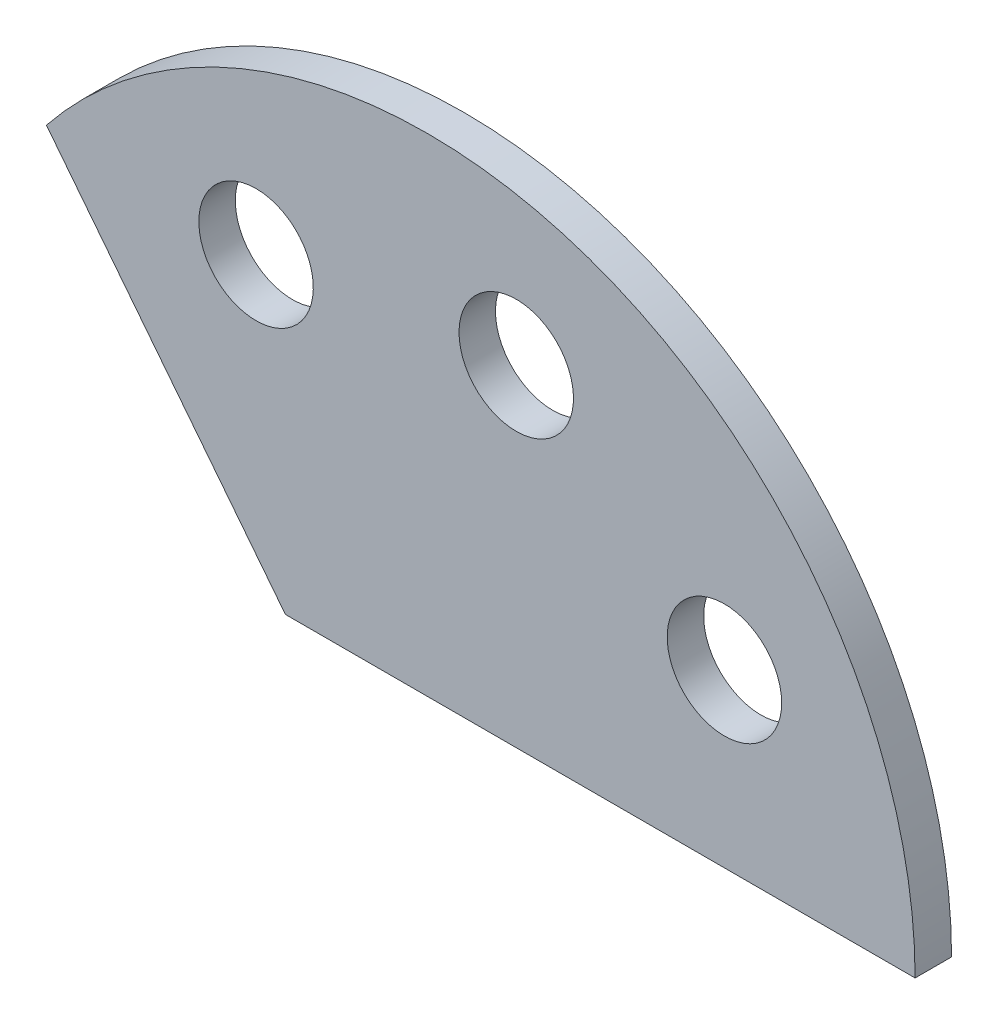
ISO-10303-21;
HEADER;
FILE_DESCRIPTION(('STEP AP214'),'2;1');
FILE_NAME('part.step','',(''),(''),'','','');
FILE_SCHEMA(('AUTOMOTIVE_DESIGN { 1 0 10303 214 1 1 1 1 }'));
ENDSEC;
DATA;
#1=APPLICATION_CONTEXT('core data for automotive mechanical design processes');
#2=APPLICATION_PROTOCOL_DEFINITION('international standard','automotive_design',2000,#1);
#3=PRODUCT_CONTEXT('',#1,'mechanical');
#4=PRODUCT('Part','Part','',(#3));
#5=PRODUCT_RELATED_PRODUCT_CATEGORY('part','',(#4));
#6=PRODUCT_DEFINITION_FORMATION('','',#4);
#7=PRODUCT_DEFINITION_CONTEXT('part definition',#1,'design');
#8=PRODUCT_DEFINITION('design','',#6,#7);
#9=PRODUCT_DEFINITION_SHAPE('','',#8);
#10=(LENGTH_UNIT() NAMED_UNIT(*) SI_UNIT(.MILLI.,.METRE.));
#11=(NAMED_UNIT(*) PLANE_ANGLE_UNIT() SI_UNIT($,.RADIAN.));
#12=(NAMED_UNIT(*) SI_UNIT($,.STERADIAN.) SOLID_ANGLE_UNIT());
#13=UNCERTAINTY_MEASURE_WITH_UNIT(LENGTH_MEASURE(1.E-05),#10,'distance_accuracy_value','');
#14=(GEOMETRIC_REPRESENTATION_CONTEXT(3) GLOBAL_UNCERTAINTY_ASSIGNED_CONTEXT((#13)) GLOBAL_UNIT_ASSIGNED_CONTEXT((#10,
#11,#12)) REPRESENTATION_CONTEXT('',''));
#15=CARTESIAN_POINT('',(0.,0.,0.));
#16=DIRECTION('',(0.,0.,1.));
#17=DIRECTION('',(1.,0.,0.));
#18=AXIS2_PLACEMENT_3D('',#15,#16,#17);
#19=CARTESIAN_POINT('',(-21.5053407886397,37.2483428800069,-4.572));
#20=DIRECTION('',(0.,0.,1.));
#21=DIRECTION('',(0.,1.,0.));
#22=AXIS2_PLACEMENT_3D('',#19,#20,#21);
#23=CYLINDRICAL_SURFACE('',#22,7.17801637442588);
#24=CARTESIAN_POINT('',(-21.5053407886397,37.2483428800069,-4.572));
#25=DIRECTION('',(0.,0.,1.));
#26=DIRECTION('',(0.,1.,0.));
#27=AXIS2_PLACEMENT_3D('',#24,#25,#26);
#28=CIRCLE('',#27,7.17801637442588);
#29=CARTESIAN_POINT('',(-21.5053407886398,44.4263592544328,-4.572));
#30=VERTEX_POINT('',#29);
#31=EDGE_CURVE('E39',#30,#30,#28,.T.);
#32=ORIENTED_EDGE('',*,*,#31,.F.);
#33=EDGE_LOOP('',(#32));
#34=FACE_BOUND('',#33,.T.);
#35=CARTESIAN_POINT('',(-21.5053407886397,37.2483428800069,0.));
#36=DIRECTION('',(0.,0.,1.));
#37=DIRECTION('',(0.,1.,0.));
#38=AXIS2_PLACEMENT_3D('',#35,#36,#37);
#39=CIRCLE('',#38,7.17801637442588);
#40=CARTESIAN_POINT('',(-21.5053407886398,44.4263592544328,0.));
#41=VERTEX_POINT('',#40);
#42=EDGE_CURVE('E11',#41,#41,#39,.T.);
#43=ORIENTED_EDGE('',*,*,#42,.T.);
#44=EDGE_LOOP('',(#43));
#45=FACE_BOUND('',#44,.T.);
#46=ADVANCED_FACE('F31',(#34,#45),#23,.F.);
#47=CARTESIAN_POINT('',(11.1319835350398,41.5451281417894,-4.572));
#48=DIRECTION('',(0.,0.,1.));
#49=DIRECTION('',(0.707106781186546,0.707106781186549,0.));
#50=AXIS2_PLACEMENT_3D('',#47,#48,#49);
#51=CYLINDRICAL_SURFACE('',#50,7.17801637442588);
#52=CARTESIAN_POINT('',(11.1319835350398,41.5451281417894,-4.572));
#53=DIRECTION('',(0.,0.,1.));
#54=DIRECTION('',(0.707106781186546,0.707106781186549,0.));
#55=AXIS2_PLACEMENT_3D('',#52,#53,#54);
#56=CIRCLE('',#55,7.17801637442588);
#57=CARTESIAN_POINT('',(16.2076075888644,46.620752195614,-4.572));
#58=VERTEX_POINT('',#57);
#59=EDGE_CURVE('E95',#58,#58,#56,.T.);
#60=ORIENTED_EDGE('',*,*,#59,.F.);
#61=EDGE_LOOP('',(#60));
#62=FACE_BOUND('',#61,.T.);
#63=CARTESIAN_POINT('',(11.1319835350398,41.5451281417894,0.));
#64=DIRECTION('',(0.,0.,1.));
#65=DIRECTION('',(0.707106781186546,0.707106781186549,0.));
#66=AXIS2_PLACEMENT_3D('',#63,#64,#65);
#67=CIRCLE('',#66,7.17801637442588);
#68=CARTESIAN_POINT('',(16.2076075888644,46.620752195614,0.));
#69=VERTEX_POINT('',#68);
#70=EDGE_CURVE('E99',#69,#69,#67,.T.);
#71=ORIENTED_EDGE('',*,*,#70,.T.);
#72=EDGE_LOOP('',(#71));
#73=FACE_BOUND('',#72,.T.);
#74=ADVANCED_FACE('F108',(#62,#73),#51,.F.);
#75=CARTESIAN_POINT('',(0.,0.,-4.572));
#76=DIRECTION('',(0.,0.,1.));
#77=DIRECTION('',(1.,0.,0.));
#78=AXIS2_PLACEMENT_3D('',#75,#76,#77);
#79=CYLINDRICAL_SURFACE('',#78,61.168535358706);
#80=CARTESIAN_POINT('',(0.,0.,0.));
#81=DIRECTION('',(0.,0.,1.));
#82=DIRECTION('',(1.,0.,0.));
#83=AXIS2_PLACEMENT_3D('',#80,#81,#82);
#84=CIRCLE('',#83,61.168535358706);
#85=CARTESIAN_POINT('',(61.168535358706,0.,0.));
#86=VERTEX_POINT('',#85);
#87=CARTESIAN_POINT('',(-47.8025145738901,38.1642413568289,0.));
#88=VERTEX_POINT('',#87);
#89=EDGE_CURVE('E90',#86,#88,#84,.T.);
#90=ORIENTED_EDGE('',*,*,#89,.F.);
#91=DIRECTION('',(0.,0.,1.));
#92=VECTOR('',#91,1.);
#93=CARTESIAN_POINT('',(61.168535358706,0.,-4.572));
#94=LINE('',#93,#92);
#95=CARTESIAN_POINT('',(61.168535358706,0.,-4.572));
#96=VERTEX_POINT('',#95);
#97=EDGE_CURVE('E47',#96,#86,#94,.T.);
#98=ORIENTED_EDGE('',*,*,#97,.F.);
#99=CARTESIAN_POINT('',(0.,0.,-4.572));
#100=DIRECTION('',(0.,0.,1.));
#101=DIRECTION('',(1.,0.,0.));
#102=AXIS2_PLACEMENT_3D('',#99,#100,#101);
#103=CIRCLE('',#102,61.168535358706);
#104=CARTESIAN_POINT('',(-47.8025145738901,38.1642413568289,-4.572));
#105=VERTEX_POINT('',#104);
#106=EDGE_CURVE('E78',#96,#105,#103,.T.);
#107=ORIENTED_EDGE('',*,*,#106,.T.);
#108=DIRECTION('',(0.,0.,1.));
#109=VECTOR('',#108,1.);
#110=CARTESIAN_POINT('',(-47.8025145738901,38.1642413568289,-4.572));
#111=LINE('',#110,#109);
#112=EDGE_CURVE('E67',#105,#88,#111,.T.);
#113=ORIENTED_EDGE('',*,*,#112,.T.);
#114=EDGE_LOOP('',(#90,#98,#107,#113));
#115=FACE_BOUND('',#114,.T.);
#116=ADVANCED_FACE('F80',(#115),#79,.T.);
#117=CARTESIAN_POINT('',(-17.8260516103918,0.,-4.572));
#118=DIRECTION('',(0.,-1.,0.));
#119=DIRECTION('',(1.,0.,0.));
#120=AXIS2_PLACEMENT_3D('',#117,#118,#119);
#121=PLANE('',#120);
#122=DIRECTION('',(1.,0.,0.));
#123=VECTOR('',#122,1.);
#124=CARTESIAN_POINT('',(-17.8260516103918,0.,0.));
#125=LINE('',#124,#123);
#126=CARTESIAN_POINT('',(-17.8260516103918,0.,0.));
#127=VERTEX_POINT('',#126);
#128=EDGE_CURVE('E81',#127,#86,#125,.T.);
#129=ORIENTED_EDGE('',*,*,#128,.F.);
#130=DIRECTION('',(0.,0.,1.));
#131=VECTOR('',#130,1.);
#132=CARTESIAN_POINT('',(-17.8260516103918,0.,-4.572));
#133=LINE('',#132,#131);
#134=CARTESIAN_POINT('',(-17.8260516103918,0.,-4.572));
#135=VERTEX_POINT('',#134);
#136=EDGE_CURVE('E61',#135,#127,#133,.T.);
#137=ORIENTED_EDGE('',*,*,#136,.F.);
#138=DIRECTION('',(1.,0.,0.));
#139=VECTOR('',#138,1.);
#140=CARTESIAN_POINT('',(-17.8260516103918,0.,-4.572));
#141=LINE('',#140,#139);
#142=EDGE_CURVE('E74',#135,#96,#141,.T.);
#143=ORIENTED_EDGE('',*,*,#142,.T.);
#144=ORIENTED_EDGE('',*,*,#97,.T.);
#145=EDGE_LOOP('',(#129,#137,#143,#144));
#146=FACE_BOUND('',#145,.T.);
#147=ADVANCED_FACE('F121',(#146),#121,.T.);
#148=CARTESIAN_POINT('',(-47.8025145738901,38.1642413568289,-4.572));
#149=DIRECTION('',(-0.786415698202875,-0.617697619891872,0.));
#150=DIRECTION('',(0.617697619891872,-0.786415698202876,0.));
#151=AXIS2_PLACEMENT_3D('',#148,#149,#150);
#152=PLANE('',#151);
#153=DIRECTION('',(0.617697619891872,-0.786415698202875,0.));
#154=VECTOR('',#153,1.);
#155=CARTESIAN_POINT('',(-47.8025145738901,38.1642413568289,0.));
#156=LINE('',#155,#154);
#157=EDGE_CURVE('E72',#88,#127,#156,.T.);
#158=ORIENTED_EDGE('',*,*,#157,.F.);
#159=ORIENTED_EDGE('',*,*,#112,.F.);
#160=DIRECTION('',(0.617697619891872,-0.786415698202875,0.));
#161=VECTOR('',#160,1.);
#162=CARTESIAN_POINT('',(-47.8025145738901,38.1642413568289,-4.572));
#163=LINE('',#162,#161);
#164=EDGE_CURVE('E70',#105,#135,#163,.T.);
#165=ORIENTED_EDGE('',*,*,#164,.T.);
#166=ORIENTED_EDGE('',*,*,#136,.T.);
#167=EDGE_LOOP('',(#158,#159,#165,#166));
#168=FACE_BOUND('',#167,.T.);
#169=ADVANCED_FACE('F69',(#168),#152,.T.);
#170=CARTESIAN_POINT('',(0.,0.,-4.572));
#171=DIRECTION('',(0.,0.,1.));
#172=DIRECTION('',(1.,0.,0.));
#173=AXIS2_PLACEMENT_3D('',#170,#171,#172);
#174=PLANE('',#173);
#175=ORIENTED_EDGE('',*,*,#31,.T.);
#176=EDGE_LOOP('',(#175));
#177=FACE_BOUND('',#176,.T.);
#178=ORIENTED_EDGE('',*,*,#59,.T.);
#179=EDGE_LOOP('',(#178));
#180=FACE_BOUND('',#179,.T.);
#181=CARTESIAN_POINT('',(37.248342880007,21.5053407886396,-4.572));
#182=DIRECTION('',(0.,0.,1.));
#183=DIRECTION('',(1.,0.,0.));
#184=AXIS2_PLACEMENT_3D('',#181,#182,#183);
#185=CIRCLE('',#184,7.17801637442588);
#186=CARTESIAN_POINT('',(44.4263592544329,21.5053407886396,-4.572));
#187=VERTEX_POINT('',#186);
#188=EDGE_CURVE('E92',#187,#187,#185,.T.);
#189=ORIENTED_EDGE('',*,*,#188,.T.);
#190=EDGE_LOOP('',(#189));
#191=FACE_BOUND('',#190,.T.);
#192=ORIENTED_EDGE('',*,*,#106,.F.);
#193=ORIENTED_EDGE('',*,*,#142,.F.);
#194=ORIENTED_EDGE('',*,*,#164,.F.);
#195=EDGE_LOOP('',(#192,#193,#194));
#196=FACE_BOUND('',#195,.T.);
#197=ADVANCED_FACE('F77',(#177,#180,#191,#196),#174,.F.);
#198=CARTESIAN_POINT('',(0.,0.,0.));
#199=DIRECTION('',(0.,0.,1.));
#200=DIRECTION('',(1.,0.,0.));
#201=AXIS2_PLACEMENT_3D('',#198,#199,#200);
#202=PLANE('',#201);
#203=ORIENTED_EDGE('',*,*,#42,.F.);
#204=EDGE_LOOP('',(#203));
#205=FACE_BOUND('',#204,.T.);
#206=ORIENTED_EDGE('',*,*,#70,.F.);
#207=EDGE_LOOP('',(#206));
#208=FACE_BOUND('',#207,.T.);
#209=CARTESIAN_POINT('',(37.248342880007,21.5053407886396,0.));
#210=DIRECTION('',(0.,0.,1.));
#211=DIRECTION('',(1.,0.,0.));
#212=AXIS2_PLACEMENT_3D('',#209,#210,#211);
#213=CIRCLE('',#212,7.17801637442588);
#214=CARTESIAN_POINT('',(44.4263592544329,21.5053407886396,0.));
#215=VERTEX_POINT('',#214);
#216=EDGE_CURVE('E86',#215,#215,#213,.T.);
#217=ORIENTED_EDGE('',*,*,#216,.F.);
#218=EDGE_LOOP('',(#217));
#219=FACE_BOUND('',#218,.T.);
#220=ORIENTED_EDGE('',*,*,#89,.T.);
#221=ORIENTED_EDGE('',*,*,#157,.T.);
#222=ORIENTED_EDGE('',*,*,#128,.T.);
#223=EDGE_LOOP('',(#220,#221,#222));
#224=FACE_BOUND('',#223,.T.);
#225=ADVANCED_FACE('F111',(#205,#208,#219,#224),#202,.T.);
#226=CARTESIAN_POINT('',(37.248342880007,21.5053407886396,-4.572));
#227=DIRECTION('',(0.,0.,1.));
#228=DIRECTION('',(1.,0.,0.));
#229=AXIS2_PLACEMENT_3D('',#226,#227,#228);
#230=CYLINDRICAL_SURFACE('',#229,7.17801637442588);
#231=ORIENTED_EDGE('',*,*,#188,.F.);
#232=EDGE_LOOP('',(#231));
#233=FACE_BOUND('',#232,.T.);
#234=ORIENTED_EDGE('',*,*,#216,.T.);
#235=EDGE_LOOP('',(#234));
#236=FACE_BOUND('',#235,.T.);
#237=ADVANCED_FACE('F114',(#233,#236),#230,.F.);
#238=CLOSED_SHELL('',(#46,#74,#116,#147,#169,#197,#225,#237));
#239=MANIFOLD_SOLID_BREP('B2',#238);
#240=ADVANCED_BREP_SHAPE_REPRESENTATION('',(#18,#239),#14);
#241=SHAPE_DEFINITION_REPRESENTATION(#9,#240);
ENDSEC;
END-ISO-10303-21;
